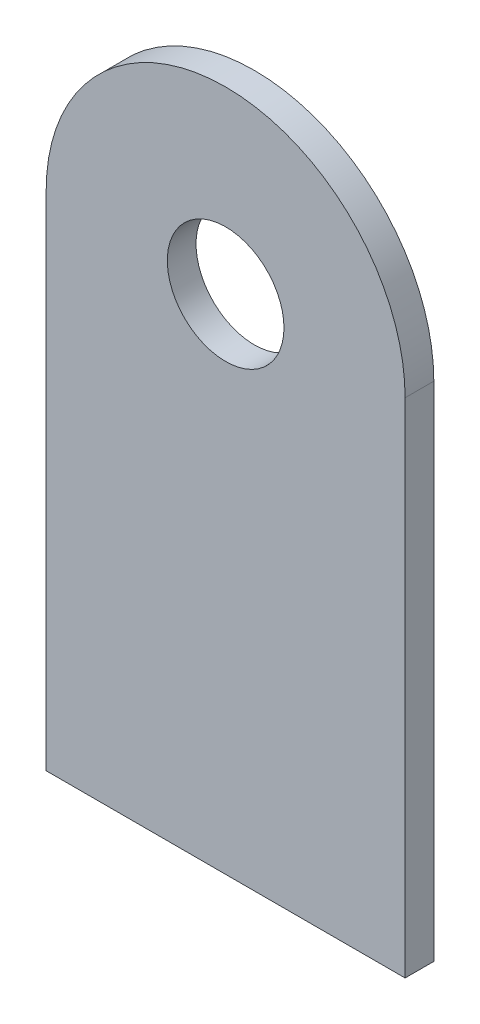
ISO-10303-21;
HEADER;
FILE_DESCRIPTION(('STEP AP214'),'2;1');
FILE_NAME('part.step','',(''),(''),'','','');
FILE_SCHEMA(('AUTOMOTIVE_DESIGN { 1 0 10303 214 1 1 1 1 }'));
ENDSEC;
DATA;
#1=APPLICATION_CONTEXT('core data for automotive mechanical design processes');
#2=APPLICATION_PROTOCOL_DEFINITION('international standard','automotive_design',2000,#1);
#3=PRODUCT_CONTEXT('',#1,'mechanical');
#4=PRODUCT('Part','Part','',(#3));
#5=PRODUCT_RELATED_PRODUCT_CATEGORY('part','',(#4));
#6=PRODUCT_DEFINITION_FORMATION('','',#4);
#7=PRODUCT_DEFINITION_CONTEXT('part definition',#1,'design');
#8=PRODUCT_DEFINITION('design','',#6,#7);
#9=PRODUCT_DEFINITION_SHAPE('','',#8);
#10=(LENGTH_UNIT() NAMED_UNIT(*) SI_UNIT(.MILLI.,.METRE.));
#11=(NAMED_UNIT(*) PLANE_ANGLE_UNIT() SI_UNIT($,.RADIAN.));
#12=(NAMED_UNIT(*) SI_UNIT($,.STERADIAN.) SOLID_ANGLE_UNIT());
#13=UNCERTAINTY_MEASURE_WITH_UNIT(LENGTH_MEASURE(1.E-05),#10,'distance_accuracy_value','');
#14=(GEOMETRIC_REPRESENTATION_CONTEXT(3) GLOBAL_UNCERTAINTY_ASSIGNED_CONTEXT((#13)) GLOBAL_UNIT_ASSIGNED_CONTEXT((#10,
#11,#12)) REPRESENTATION_CONTEXT('',''));
#15=CARTESIAN_POINT('',(0.,0.,0.));
#16=DIRECTION('',(0.,0.,1.));
#17=DIRECTION('',(1.,0.,0.));
#18=AXIS2_PLACEMENT_3D('',#15,#16,#17);
#19=CARTESIAN_POINT('',(7.9375,22.225,1.27));
#20=DIRECTION('',(0.,0.,-1.));
#21=DIRECTION('',(-1.,0.,0.));
#22=AXIS2_PLACEMENT_3D('',#19,#20,#21);
#23=CYLINDRICAL_SURFACE('',#22,7.9375);
#24=CARTESIAN_POINT('',(7.9375,22.225,0.));
#25=DIRECTION('',(0.,0.,1.));
#26=DIRECTION('',(1.,0.,0.));
#27=AXIS2_PLACEMENT_3D('',#24,#25,#26);
#28=CIRCLE('',#27,7.9375);
#29=CARTESIAN_POINT('',(0.,22.225,0.));
#30=VERTEX_POINT('',#29);
#31=CARTESIAN_POINT('',(15.875,22.225,0.));
#32=VERTEX_POINT('',#31);
#33=EDGE_CURVE('E110',#30,#32,#28,.F.);
#34=ORIENTED_EDGE('',*,*,#33,.F.);
#35=DIRECTION('',(0.,0.,-1.));
#36=VECTOR('',#35,1.);
#37=CARTESIAN_POINT('',(0.,22.225,1.27));
#38=LINE('',#37,#36);
#39=CARTESIAN_POINT('',(0.,22.225,1.27));
#40=VERTEX_POINT('',#39);
#41=EDGE_CURVE('E11',#40,#30,#38,.T.);
#42=ORIENTED_EDGE('',*,*,#41,.F.);
#43=CARTESIAN_POINT('',(7.9375,22.225,1.27));
#44=DIRECTION('',(0.,0.,1.));
#45=DIRECTION('',(1.,0.,0.));
#46=AXIS2_PLACEMENT_3D('',#43,#44,#45);
#47=CIRCLE('',#46,7.9375);
#48=CARTESIAN_POINT('',(15.875,22.225,1.27));
#49=VERTEX_POINT('',#48);
#50=EDGE_CURVE('E100',#40,#49,#47,.F.);
#51=ORIENTED_EDGE('',*,*,#50,.T.);
#52=DIRECTION('',(0.,0.,-1.));
#53=VECTOR('',#52,1.);
#54=CARTESIAN_POINT('',(15.875,22.225,1.27));
#55=LINE('',#54,#53);
#56=EDGE_CURVE('E79',#49,#32,#55,.T.);
#57=ORIENTED_EDGE('',*,*,#56,.T.);
#58=EDGE_LOOP('',(#34,#42,#51,#57));
#59=FACE_BOUND('',#58,.T.);
#60=ADVANCED_FACE('F39',(#59),#23,.T.);
#61=CARTESIAN_POINT('',(0.,0.,1.27));
#62=DIRECTION('',(-1.,0.,0.));
#63=DIRECTION('',(0.,0.,1.));
#64=AXIS2_PLACEMENT_3D('',#61,#62,#63);
#65=PLANE('',#64);
#66=DIRECTION('',(0.,1.,0.));
#67=VECTOR('',#66,1.);
#68=CARTESIAN_POINT('',(0.,0.,0.));
#69=LINE('',#68,#67);
#70=CARTESIAN_POINT('',(0.,0.,0.));
#71=VERTEX_POINT('',#70);
#72=EDGE_CURVE('E91',#71,#30,#69,.T.);
#73=ORIENTED_EDGE('',*,*,#72,.F.);
#74=DIRECTION('',(0.,0.,-1.));
#75=VECTOR('',#74,1.);
#76=CARTESIAN_POINT('',(0.,0.,1.27));
#77=LINE('',#76,#75);
#78=CARTESIAN_POINT('',(0.,0.,1.27));
#79=VERTEX_POINT('',#78);
#80=EDGE_CURVE('E48',#79,#71,#77,.T.);
#81=ORIENTED_EDGE('',*,*,#80,.F.);
#82=DIRECTION('',(0.,1.,0.));
#83=VECTOR('',#82,1.);
#84=CARTESIAN_POINT('',(0.,0.,1.27));
#85=LINE('',#84,#83);
#86=EDGE_CURVE('E89',#79,#40,#85,.T.);
#87=ORIENTED_EDGE('',*,*,#86,.T.);
#88=ORIENTED_EDGE('',*,*,#41,.T.);
#89=EDGE_LOOP('',(#73,#81,#87,#88));
#90=FACE_BOUND('',#89,.T.);
#91=ADVANCED_FACE('F87',(#90),#65,.T.);
#92=CARTESIAN_POINT('',(0.,0.,1.27));
#93=DIRECTION('',(0.,1.,0.));
#94=DIRECTION('',(0.,0.,1.));
#95=AXIS2_PLACEMENT_3D('',#92,#93,#94);
#96=PLANE('',#95);
#97=DIRECTION('',(1.,0.,0.));
#98=VECTOR('',#97,1.);
#99=CARTESIAN_POINT('',(0.,0.,0.));
#100=LINE('',#99,#98);
#101=CARTESIAN_POINT('',(15.875,0.,0.));
#102=VERTEX_POINT('',#101);
#103=EDGE_CURVE('E113',#71,#102,#100,.T.);
#104=ORIENTED_EDGE('',*,*,#103,.T.);
#105=DIRECTION('',(0.,0.,-1.));
#106=VECTOR('',#105,1.);
#107=CARTESIAN_POINT('',(15.875,0.,1.27));
#108=LINE('',#107,#106);
#109=CARTESIAN_POINT('',(15.875,0.,1.27));
#110=VERTEX_POINT('',#109);
#111=EDGE_CURVE('E94',#110,#102,#108,.T.);
#112=ORIENTED_EDGE('',*,*,#111,.F.);
#113=DIRECTION('',(1.,0.,0.));
#114=VECTOR('',#113,1.);
#115=CARTESIAN_POINT('',(0.,0.,1.27));
#116=LINE('',#115,#114);
#117=EDGE_CURVE('E96',#79,#110,#116,.T.);
#118=ORIENTED_EDGE('',*,*,#117,.F.);
#119=ORIENTED_EDGE('',*,*,#80,.T.);
#120=EDGE_LOOP('',(#104,#112,#118,#119));
#121=FACE_BOUND('',#120,.T.);
#122=ADVANCED_FACE('F97',(#121),#96,.F.);
#123=CARTESIAN_POINT('',(7.9375,22.225,1.27));
#124=DIRECTION('',(0.,0.,-1.));
#125=DIRECTION('',(-1.,0.,0.));
#126=AXIS2_PLACEMENT_3D('',#123,#124,#125);
#127=CYLINDRICAL_SURFACE('',#126,2.5796875);
#128=CARTESIAN_POINT('',(7.9375,22.225,1.27));
#129=DIRECTION('',(0.,0.,1.));
#130=DIRECTION('',(1.,0.,0.));
#131=AXIS2_PLACEMENT_3D('',#128,#129,#130);
#132=CIRCLE('',#131,2.5796875);
#133=CARTESIAN_POINT('',(10.5171875,22.225,1.27));
#134=VERTEX_POINT('',#133);
#135=EDGE_CURVE('E102',#134,#134,#132,.T.);
#136=ORIENTED_EDGE('',*,*,#135,.T.);
#137=EDGE_LOOP('',(#136));
#138=FACE_BOUND('',#137,.T.);
#139=CARTESIAN_POINT('',(7.9375,22.225,0.));
#140=DIRECTION('',(0.,0.,1.));
#141=DIRECTION('',(1.,0.,0.));
#142=AXIS2_PLACEMENT_3D('',#139,#140,#141);
#143=CIRCLE('',#142,2.5796875);
#144=CARTESIAN_POINT('',(10.5171875,22.225,0.));
#145=VERTEX_POINT('',#144);
#146=EDGE_CURVE('E107',#145,#145,#143,.T.);
#147=ORIENTED_EDGE('',*,*,#146,.F.);
#148=EDGE_LOOP('',(#147));
#149=FACE_BOUND('',#148,.T.);
#150=ADVANCED_FACE('F41',(#138,#149),#127,.F.);
#151=CARTESIAN_POINT('',(15.875,0.,1.27));
#152=DIRECTION('',(-1.,0.,0.));
#153=DIRECTION('',(0.,0.,1.));
#154=AXIS2_PLACEMENT_3D('',#151,#152,#153);
#155=PLANE('',#154);
#156=DIRECTION('',(0.,1.,0.));
#157=VECTOR('',#156,1.);
#158=CARTESIAN_POINT('',(15.875,0.,0.));
#159=LINE('',#158,#157);
#160=EDGE_CURVE('E72',#102,#32,#159,.T.);
#161=ORIENTED_EDGE('',*,*,#160,.T.);
#162=ORIENTED_EDGE('',*,*,#56,.F.);
#163=DIRECTION('',(0.,1.,0.));
#164=VECTOR('',#163,1.);
#165=CARTESIAN_POINT('',(15.875,0.,1.27));
#166=LINE('',#165,#164);
#167=EDGE_CURVE('E56',#110,#49,#166,.T.);
#168=ORIENTED_EDGE('',*,*,#167,.F.);
#169=ORIENTED_EDGE('',*,*,#111,.T.);
#170=EDGE_LOOP('',(#161,#162,#168,#169));
#171=FACE_BOUND('',#170,.T.);
#172=ADVANCED_FACE('F118',(#171),#155,.F.);
#173=CARTESIAN_POINT('',(0.,0.,1.27));
#174=DIRECTION('',(0.,0.,1.));
#175=DIRECTION('',(1.,0.,0.));
#176=AXIS2_PLACEMENT_3D('',#173,#174,#175);
#177=PLANE('',#176);
#178=ORIENTED_EDGE('',*,*,#135,.F.);
#179=EDGE_LOOP('',(#178));
#180=FACE_BOUND('',#179,.T.);
#181=ORIENTED_EDGE('',*,*,#50,.F.);
#182=ORIENTED_EDGE('',*,*,#86,.F.);
#183=ORIENTED_EDGE('',*,*,#117,.T.);
#184=ORIENTED_EDGE('',*,*,#167,.T.);
#185=EDGE_LOOP('',(#181,#182,#183,#184));
#186=FACE_BOUND('',#185,.T.);
#187=ADVANCED_FACE('F99',(#180,#186),#177,.T.);
#188=CARTESIAN_POINT('',(0.,0.,0.));
#189=DIRECTION('',(0.,0.,1.));
#190=DIRECTION('',(1.,0.,0.));
#191=AXIS2_PLACEMENT_3D('',#188,#189,#190);
#192=PLANE('',#191);
#193=ORIENTED_EDGE('',*,*,#146,.T.);
#194=EDGE_LOOP('',(#193));
#195=FACE_BOUND('',#194,.T.);
#196=ORIENTED_EDGE('',*,*,#33,.T.);
#197=ORIENTED_EDGE('',*,*,#160,.F.);
#198=ORIENTED_EDGE('',*,*,#103,.F.);
#199=ORIENTED_EDGE('',*,*,#72,.T.);
#200=EDGE_LOOP('',(#196,#197,#198,#199));
#201=FACE_BOUND('',#200,.T.);
#202=ADVANCED_FACE('F119',(#195,#201),#192,.F.);
#203=CLOSED_SHELL('',(#60,#91,#122,#150,#172,#187,#202));
#204=MANIFOLD_SOLID_BREP('B2',#203);
#205=ADVANCED_BREP_SHAPE_REPRESENTATION('',(#18,#204),#14);
#206=SHAPE_DEFINITION_REPRESENTATION(#9,#205);
ENDSEC;
END-ISO-10303-21;
